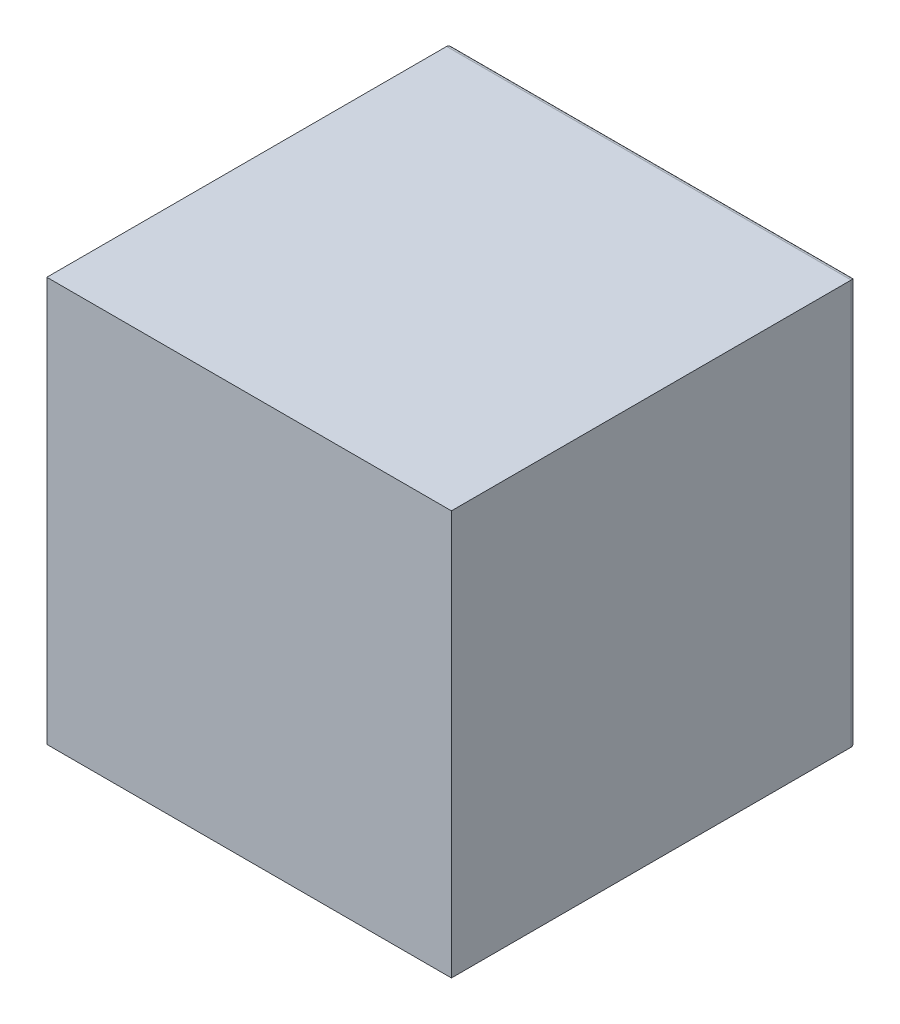
ISO-10303-21;
HEADER;
FILE_DESCRIPTION(('STEP AP214'),'2;1');
FILE_NAME('part.step','',(''),(''),'','','');
FILE_SCHEMA(('AUTOMOTIVE_DESIGN { 1 0 10303 214 1 1 1 1 }'));
ENDSEC;
DATA;
#1=APPLICATION_CONTEXT('core data for automotive mechanical design processes');
#2=APPLICATION_PROTOCOL_DEFINITION('international standard','automotive_design',2000,#1);
#3=PRODUCT_CONTEXT('',#1,'mechanical');
#4=PRODUCT('Part','Part','',(#3));
#5=PRODUCT_RELATED_PRODUCT_CATEGORY('part','',(#4));
#6=PRODUCT_DEFINITION_FORMATION('','',#4);
#7=PRODUCT_DEFINITION_CONTEXT('part definition',#1,'design');
#8=PRODUCT_DEFINITION('design','',#6,#7);
#9=PRODUCT_DEFINITION_SHAPE('','',#8);
#10=(LENGTH_UNIT() NAMED_UNIT(*) SI_UNIT(.MILLI.,.METRE.));
#11=(NAMED_UNIT(*) PLANE_ANGLE_UNIT() SI_UNIT($,.RADIAN.));
#12=(NAMED_UNIT(*) SI_UNIT($,.STERADIAN.) SOLID_ANGLE_UNIT());
#13=UNCERTAINTY_MEASURE_WITH_UNIT(LENGTH_MEASURE(1.E-05),#10,'distance_accuracy_value','');
#14=(GEOMETRIC_REPRESENTATION_CONTEXT(3) GLOBAL_UNCERTAINTY_ASSIGNED_CONTEXT((#13)) GLOBAL_UNIT_ASSIGNED_CONTEXT((#10,
#11,#12)) REPRESENTATION_CONTEXT('',''));
#15=CARTESIAN_POINT('',(0.,0.,0.));
#16=DIRECTION('',(0.,0.,1.));
#17=DIRECTION('',(1.,0.,0.));
#18=AXIS2_PLACEMENT_3D('',#15,#16,#17);
#19=CARTESIAN_POINT('',(0.,2500.,0.));
#20=DIRECTION('',(0.,0.,1.));
#21=DIRECTION('',(1.,0.,0.));
#22=AXIS2_PLACEMENT_3D('',#19,#20,#21);
#23=PLANE('',#22);
#24=DIRECTION('',(-1.,0.,0.));
#25=VECTOR('',#24,1.);
#26=CARTESIAN_POINT('',(0.,29.9999999999998,0.));
#27=LINE('',#26,#25);
#28=CARTESIAN_POINT('',(2470.,29.9999999999998,0.));
#29=VERTEX_POINT('',#28);
#30=CARTESIAN_POINT('',(30.,29.9999999999998,0.));
#31=VERTEX_POINT('',#30);
#32=EDGE_CURVE('E163',#29,#31,#27,.T.);
#33=ORIENTED_EDGE('',*,*,#32,.T.);
#34=DIRECTION('',(0.,-1.,0.));
#35=VECTOR('',#34,1.);
#36=CARTESIAN_POINT('',(30.,2500.,0.));
#37=LINE('',#36,#35);
#38=CARTESIAN_POINT('',(30.,2470.,0.));
#39=VERTEX_POINT('',#38);
#40=EDGE_CURVE('E169',#31,#39,#37,.F.);
#41=ORIENTED_EDGE('',*,*,#40,.T.);
#42=DIRECTION('',(-1.,0.,0.));
#43=VECTOR('',#42,1.);
#44=CARTESIAN_POINT('',(2500.,2470.,0.));
#45=LINE('',#44,#43);
#46=CARTESIAN_POINT('',(2470.,2470.,0.));
#47=VERTEX_POINT('',#46);
#48=EDGE_CURVE('E167',#39,#47,#45,.F.);
#49=ORIENTED_EDGE('',*,*,#48,.T.);
#50=DIRECTION('',(0.,-1.,0.));
#51=VECTOR('',#50,1.);
#52=CARTESIAN_POINT('',(2470.,2500.,0.));
#53=LINE('',#52,#51);
#54=EDGE_CURVE('E165',#47,#29,#53,.T.);
#55=ORIENTED_EDGE('',*,*,#54,.T.);
#56=EDGE_LOOP('',(#33,#41,#49,#55));
#57=FACE_BOUND('',#56,.T.);
#58=DIRECTION('',(0.,1.,0.));
#59=VECTOR('',#58,1.);
#60=CARTESIAN_POINT('',(1974.66392548722,2000.,0.));
#61=LINE('',#60,#59);
#62=CARTESIAN_POINT('',(1974.66392548722,500.,0.));
#63=VERTEX_POINT('',#62);
#64=CARTESIAN_POINT('',(1974.66392548722,2000.,0.));
#65=VERTEX_POINT('',#64);
#66=EDGE_CURVE('E184',#63,#65,#61,.T.);
#67=ORIENTED_EDGE('',*,*,#66,.T.);
#68=DIRECTION('',(-1.,0.,0.));
#69=VECTOR('',#68,1.);
#70=CARTESIAN_POINT('',(474.663925487217,2000.,0.));
#71=LINE('',#70,#69);
#72=CARTESIAN_POINT('',(474.663925487217,2000.,0.));
#73=VERTEX_POINT('',#72);
#74=EDGE_CURVE('E135',#65,#73,#71,.T.);
#75=ORIENTED_EDGE('',*,*,#74,.T.);
#76=DIRECTION('',(0.,-1.,0.));
#77=VECTOR('',#76,1.);
#78=CARTESIAN_POINT('',(474.663925487217,2000.,0.));
#79=LINE('',#78,#77);
#80=CARTESIAN_POINT('',(474.663925487217,500.,0.));
#81=VERTEX_POINT('',#80);
#82=EDGE_CURVE('E192',#73,#81,#79,.T.);
#83=ORIENTED_EDGE('',*,*,#82,.T.);
#84=DIRECTION('',(1.,0.,0.));
#85=VECTOR('',#84,1.);
#86=CARTESIAN_POINT('',(474.663925487217,500.,0.));
#87=LINE('',#86,#85);
#88=EDGE_CURVE('E131',#81,#63,#87,.T.);
#89=ORIENTED_EDGE('',*,*,#88,.T.);
#90=EDGE_LOOP('',(#67,#75,#83,#89));
#91=FACE_BOUND('',#90,.T.);
#92=ADVANCED_FACE('F34',(#57,#91),#23,.F.);
#93=CARTESIAN_POINT('',(0.,2500.,0.));
#94=DIRECTION('',(1.,0.,0.));
#95=DIRECTION('',(0.,0.,-1.));
#96=AXIS2_PLACEMENT_3D('',#93,#94,#95);
#97=PLANE('',#96);
#98=DIRECTION('',(0.,0.,1.));
#99=VECTOR('',#98,1.);
#100=CARTESIAN_POINT('',(0.,2500.,0.));
#101=LINE('',#100,#99);
#102=CARTESIAN_POINT('',(0.,2500.,30.));
#103=VERTEX_POINT('',#102);
#104=CARTESIAN_POINT('',(3.06161699786838E-13,2500.,2500.));
#105=VERTEX_POINT('',#104);
#106=EDGE_CURVE('E145',#103,#105,#101,.T.);
#107=ORIENTED_EDGE('',*,*,#106,.F.);
#108=DIRECTION('',(0.,-1.,0.));
#109=VECTOR('',#108,1.);
#110=CARTESIAN_POINT('',(0.,2500.,30.));
#111=LINE('',#110,#109);
#112=CARTESIAN_POINT('',(0.,0.,30.));
#113=VERTEX_POINT('',#112);
#114=EDGE_CURVE('E160',#103,#113,#111,.T.);
#115=ORIENTED_EDGE('',*,*,#114,.T.);
#116=DIRECTION('',(0.,0.,1.));
#117=VECTOR('',#116,1.);
#118=CARTESIAN_POINT('',(0.,0.,0.));
#119=LINE('',#118,#117);
#120=CARTESIAN_POINT('',(3.06161699786838E-13,0.,2500.));
#121=VERTEX_POINT('',#120);
#122=EDGE_CURVE('E136',#113,#121,#119,.T.);
#123=ORIENTED_EDGE('',*,*,#122,.T.);
#124=DIRECTION('',(0.,-1.,0.));
#125=VECTOR('',#124,1.);
#126=CARTESIAN_POINT('',(3.06161699786838E-13,2500.,2500.));
#127=LINE('',#126,#125);
#128=EDGE_CURVE('E157',#105,#121,#127,.T.);
#129=ORIENTED_EDGE('',*,*,#128,.F.);
#130=EDGE_LOOP('',(#107,#115,#123,#129));
#131=FACE_BOUND('',#130,.T.);
#132=ADVANCED_FACE('F209',(#131),#97,.F.);
#133=CARTESIAN_POINT('',(3.06161699786838E-13,2500.,2500.));
#134=DIRECTION('',(0.,0.,-1.));
#135=DIRECTION('',(-1.,0.,0.));
#136=AXIS2_PLACEMENT_3D('',#133,#134,#135);
#137=PLANE('',#136);
#138=DIRECTION('',(1.,0.,0.));
#139=VECTOR('',#138,1.);
#140=CARTESIAN_POINT('',(3.06161699786838E-13,0.,2500.));
#141=LINE('',#140,#139);
#142=CARTESIAN_POINT('',(2500.,0.,2500.));
#143=VERTEX_POINT('',#142);
#144=EDGE_CURVE('E139',#121,#143,#141,.T.);
#145=ORIENTED_EDGE('',*,*,#144,.T.);
#146=DIRECTION('',(0.,-1.,0.));
#147=VECTOR('',#146,1.);
#148=CARTESIAN_POINT('',(2500.,2500.,2500.));
#149=LINE('',#148,#147);
#150=CARTESIAN_POINT('',(2500.,2500.,2500.));
#151=VERTEX_POINT('',#150);
#152=EDGE_CURVE('E151',#151,#143,#149,.T.);
#153=ORIENTED_EDGE('',*,*,#152,.F.);
#154=DIRECTION('',(1.,0.,0.));
#155=VECTOR('',#154,1.);
#156=CARTESIAN_POINT('',(3.06161699786838E-13,2500.,2500.));
#157=LINE('',#156,#155);
#158=EDGE_CURVE('E147',#105,#151,#157,.T.);
#159=ORIENTED_EDGE('',*,*,#158,.F.);
#160=ORIENTED_EDGE('',*,*,#128,.T.);
#161=EDGE_LOOP('',(#145,#153,#159,#160));
#162=FACE_BOUND('',#161,.T.);
#163=ADVANCED_FACE('F215',(#162),#137,.F.);
#164=CARTESIAN_POINT('',(2500.,2500.,0.));
#165=DIRECTION('',(-1.,0.,0.));
#166=DIRECTION('',(0.,0.,1.));
#167=AXIS2_PLACEMENT_3D('',#164,#165,#166);
#168=PLANE('',#167);
#169=DIRECTION('',(0.,0.,-1.));
#170=VECTOR('',#169,1.);
#171=CARTESIAN_POINT('',(2500.,0.,0.));
#172=LINE('',#171,#170);
#173=CARTESIAN_POINT('',(2500.,0.,30.));
#174=VERTEX_POINT('',#173);
#175=EDGE_CURVE('E148',#143,#174,#172,.T.);
#176=ORIENTED_EDGE('',*,*,#175,.T.);
#177=DIRECTION('',(0.,-1.,0.));
#178=VECTOR('',#177,1.);
#179=CARTESIAN_POINT('',(2500.,2500.,30.));
#180=LINE('',#179,#178);
#181=CARTESIAN_POINT('',(2500.,2500.,30.));
#182=VERTEX_POINT('',#181);
#183=EDGE_CURVE('E43',#174,#182,#180,.F.);
#184=ORIENTED_EDGE('',*,*,#183,.T.);
#185=DIRECTION('',(0.,0.,-1.));
#186=VECTOR('',#185,1.);
#187=CARTESIAN_POINT('',(2500.,2500.,0.));
#188=LINE('',#187,#186);
#189=EDGE_CURVE('E150',#151,#182,#188,.T.);
#190=ORIENTED_EDGE('',*,*,#189,.F.);
#191=ORIENTED_EDGE('',*,*,#152,.T.);
#192=EDGE_LOOP('',(#176,#184,#190,#191));
#193=FACE_BOUND('',#192,.T.);
#194=ADVANCED_FACE('F222',(#193),#168,.F.);
#195=CARTESIAN_POINT('',(0.,2500.,0.));
#196=DIRECTION('',(0.,1.,0.));
#197=DIRECTION('',(0.,0.,1.));
#198=AXIS2_PLACEMENT_3D('',#195,#196,#197);
#199=PLANE('',#198);
#200=ORIENTED_EDGE('',*,*,#189,.T.);
#201=DIRECTION('',(-1.,0.,0.));
#202=VECTOR('',#201,1.);
#203=CARTESIAN_POINT('',(0.,2500.,30.));
#204=LINE('',#203,#202);
#205=EDGE_CURVE('E172',#182,#103,#204,.T.);
#206=ORIENTED_EDGE('',*,*,#205,.T.);
#207=ORIENTED_EDGE('',*,*,#106,.T.);
#208=ORIENTED_EDGE('',*,*,#158,.T.);
#209=EDGE_LOOP('',(#200,#206,#207,#208));
#210=FACE_BOUND('',#209,.T.);
#211=ADVANCED_FACE('F225',(#210),#199,.T.);
#212=CARTESIAN_POINT('',(0.,0.,0.));
#213=DIRECTION('',(0.,1.,0.));
#214=DIRECTION('',(0.,0.,1.));
#215=AXIS2_PLACEMENT_3D('',#212,#213,#214);
#216=PLANE('',#215);
#217=ORIENTED_EDGE('',*,*,#122,.F.);
#218=DIRECTION('',(-1.,0.,0.));
#219=VECTOR('',#218,1.);
#220=CARTESIAN_POINT('',(0.,0.,30.));
#221=LINE('',#220,#219);
#222=EDGE_CURVE('E11',#113,#174,#221,.F.);
#223=ORIENTED_EDGE('',*,*,#222,.T.);
#224=ORIENTED_EDGE('',*,*,#175,.F.);
#225=ORIENTED_EDGE('',*,*,#144,.F.);
#226=EDGE_LOOP('',(#217,#223,#224,#225));
#227=FACE_BOUND('',#226,.T.);
#228=ADVANCED_FACE('F220',(#227),#216,.F.);
#229=CARTESIAN_POINT('',(1974.66392548722,2000.,500.));
#230=DIRECTION('',(-1.,0.,0.));
#231=DIRECTION('',(0.,0.,1.));
#232=AXIS2_PLACEMENT_3D('',#229,#230,#231);
#233=PLANE('',#232);
#234=ORIENTED_EDGE('',*,*,#66,.F.);
#235=DIRECTION('',(0.,0.,-1.));
#236=VECTOR('',#235,1.);
#237=CARTESIAN_POINT('',(1974.66392548722,500.,500.));
#238=LINE('',#237,#236);
#239=CARTESIAN_POINT('',(1974.66392548722,500.,500.));
#240=VERTEX_POINT('',#239);
#241=EDGE_CURVE('E130',#240,#63,#238,.T.);
#242=ORIENTED_EDGE('',*,*,#241,.F.);
#243=DIRECTION('',(0.,1.,0.));
#244=VECTOR('',#243,1.);
#245=CARTESIAN_POINT('',(1974.66392548722,2000.,500.));
#246=LINE('',#245,#244);
#247=CARTESIAN_POINT('',(1974.66392548722,2000.,500.));
#248=VERTEX_POINT('',#247);
#249=EDGE_CURVE('E117',#240,#248,#246,.T.);
#250=ORIENTED_EDGE('',*,*,#249,.T.);
#251=DIRECTION('',(0.,0.,-1.));
#252=VECTOR('',#251,1.);
#253=CARTESIAN_POINT('',(1974.66392548722,2000.,500.));
#254=LINE('',#253,#252);
#255=EDGE_CURVE('E127',#248,#65,#254,.T.);
#256=ORIENTED_EDGE('',*,*,#255,.T.);
#257=EDGE_LOOP('',(#234,#242,#250,#256));
#258=FACE_BOUND('',#257,.T.);
#259=ADVANCED_FACE('F126',(#258),#233,.T.);
#260=CARTESIAN_POINT('',(474.663925487217,2000.,500.));
#261=DIRECTION('',(0.,-1.,0.));
#262=DIRECTION('',(0.,0.,-1.));
#263=AXIS2_PLACEMENT_3D('',#260,#261,#262);
#264=PLANE('',#263);
#265=ORIENTED_EDGE('',*,*,#74,.F.);
#266=ORIENTED_EDGE('',*,*,#255,.F.);
#267=DIRECTION('',(-1.,0.,0.));
#268=VECTOR('',#267,1.);
#269=CARTESIAN_POINT('',(474.663925487217,2000.,500.));
#270=LINE('',#269,#268);
#271=CARTESIAN_POINT('',(474.663925487217,2000.,500.));
#272=VERTEX_POINT('',#271);
#273=EDGE_CURVE('E113',#248,#272,#270,.T.);
#274=ORIENTED_EDGE('',*,*,#273,.T.);
#275=DIRECTION('',(0.,0.,-1.));
#276=VECTOR('',#275,1.);
#277=CARTESIAN_POINT('',(474.663925487217,2000.,500.));
#278=LINE('',#277,#276);
#279=EDGE_CURVE('E137',#272,#73,#278,.T.);
#280=ORIENTED_EDGE('',*,*,#279,.T.);
#281=EDGE_LOOP('',(#265,#266,#274,#280));
#282=FACE_BOUND('',#281,.T.);
#283=ADVANCED_FACE('F133',(#282),#264,.T.);
#284=CARTESIAN_POINT('',(474.663925487217,2000.,500.));
#285=DIRECTION('',(1.,0.,0.));
#286=DIRECTION('',(0.,1.,0.));
#287=AXIS2_PLACEMENT_3D('',#284,#285,#286);
#288=PLANE('',#287);
#289=ORIENTED_EDGE('',*,*,#82,.F.);
#290=ORIENTED_EDGE('',*,*,#279,.F.);
#291=DIRECTION('',(0.,-1.,0.));
#292=VECTOR('',#291,1.);
#293=CARTESIAN_POINT('',(474.663925487217,2000.,500.));
#294=LINE('',#293,#292);
#295=CARTESIAN_POINT('',(474.663925487217,500.,500.));
#296=VERTEX_POINT('',#295);
#297=EDGE_CURVE('E118',#272,#296,#294,.T.);
#298=ORIENTED_EDGE('',*,*,#297,.T.);
#299=DIRECTION('',(0.,0.,-1.));
#300=VECTOR('',#299,1.);
#301=CARTESIAN_POINT('',(474.663925487217,500.,500.));
#302=LINE('',#301,#300);
#303=EDGE_CURVE('E141',#296,#81,#302,.T.);
#304=ORIENTED_EDGE('',*,*,#303,.T.);
#305=EDGE_LOOP('',(#289,#290,#298,#304));
#306=FACE_BOUND('',#305,.T.);
#307=ADVANCED_FACE('F205',(#306),#288,.T.);
#308=CARTESIAN_POINT('',(474.663925487217,500.,500.));
#309=DIRECTION('',(0.,1.,0.));
#310=DIRECTION('',(0.,0.,1.));
#311=AXIS2_PLACEMENT_3D('',#308,#309,#310);
#312=PLANE('',#311);
#313=ORIENTED_EDGE('',*,*,#88,.F.);
#314=ORIENTED_EDGE('',*,*,#303,.F.);
#315=DIRECTION('',(1.,0.,0.));
#316=VECTOR('',#315,1.);
#317=CARTESIAN_POINT('',(474.663925487217,500.,500.));
#318=LINE('',#317,#316);
#319=EDGE_CURVE('E195',#296,#240,#318,.T.);
#320=ORIENTED_EDGE('',*,*,#319,.T.);
#321=ORIENTED_EDGE('',*,*,#241,.T.);
#322=EDGE_LOOP('',(#313,#314,#320,#321));
#323=FACE_BOUND('',#322,.T.);
#324=ADVANCED_FACE('F207',(#323),#312,.T.);
#325=CARTESIAN_POINT('',(0.,0.,500.));
#326=DIRECTION('',(0.,0.,1.));
#327=DIRECTION('',(1.,0.,0.));
#328=AXIS2_PLACEMENT_3D('',#325,#326,#327);
#329=PLANE('',#328);
#330=ORIENTED_EDGE('',*,*,#249,.F.);
#331=ORIENTED_EDGE('',*,*,#319,.F.);
#332=ORIENTED_EDGE('',*,*,#297,.F.);
#333=ORIENTED_EDGE('',*,*,#273,.F.);
#334=EDGE_LOOP('',(#330,#331,#332,#333));
#335=FACE_BOUND('',#334,.T.);
#336=ADVANCED_FACE('F115',(#335),#329,.F.);
#337=CARTESIAN_POINT('',(2470.,2500.,30.));
#338=DIRECTION('',(0.,-1.,0.));
#339=DIRECTION('',(0.,0.,-1.));
#340=AXIS2_PLACEMENT_3D('',#337,#338,#339);
#341=CYLINDRICAL_SURFACE('',#340,30.);
#342=CARTESIAN_POINT('',(2470.,29.9999999999998,30.));
#343=DIRECTION('',(-0.707106781186547,-0.707106781186547,0.));
#344=DIRECTION('',(-0.707106781186547,0.707106781186547,0.));
#345=AXIS2_PLACEMENT_3D('',#342,#343,#344);
#346=ELLIPSE('',#345,42.4264068711928,30.);
#347=EDGE_CURVE('E178',#29,#174,#346,.T.);
#348=ORIENTED_EDGE('',*,*,#347,.F.);
#349=ORIENTED_EDGE('',*,*,#54,.F.);
#350=CARTESIAN_POINT('',(2470.,2470.,30.));
#351=DIRECTION('',(0.707106781186547,-0.707106781186547,0.));
#352=DIRECTION('',(-0.707106781186547,-0.707106781186547,0.));
#353=AXIS2_PLACEMENT_3D('',#350,#351,#352);
#354=ELLIPSE('',#353,42.4264068711928,30.);
#355=EDGE_CURVE('E38',#182,#47,#354,.F.);
#356=ORIENTED_EDGE('',*,*,#355,.F.);
#357=ORIENTED_EDGE('',*,*,#183,.F.);
#358=EDGE_LOOP('',(#348,#349,#356,#357));
#359=FACE_BOUND('',#358,.T.);
#360=ADVANCED_FACE('F36',(#359),#341,.T.);
#361=CARTESIAN_POINT('',(0.,2470.,30.));
#362=DIRECTION('',(1.,0.,0.));
#363=DIRECTION('',(0.,0.,-1.));
#364=AXIS2_PLACEMENT_3D('',#361,#362,#363);
#365=CYLINDRICAL_SURFACE('',#364,30.);
#366=ORIENTED_EDGE('',*,*,#355,.T.);
#367=ORIENTED_EDGE('',*,*,#48,.F.);
#368=CARTESIAN_POINT('',(30.,2470.,30.));
#369=DIRECTION('',(0.707106781186547,0.707106781186547,0.));
#370=DIRECTION('',(0.707106781186547,-0.707106781186547,0.));
#371=AXIS2_PLACEMENT_3D('',#368,#369,#370);
#372=ELLIPSE('',#371,42.4264068711928,30.);
#373=EDGE_CURVE('E177',#103,#39,#372,.F.);
#374=ORIENTED_EDGE('',*,*,#373,.F.);
#375=ORIENTED_EDGE('',*,*,#205,.F.);
#376=EDGE_LOOP('',(#366,#367,#374,#375));
#377=FACE_BOUND('',#376,.T.);
#378=ADVANCED_FACE('F235',(#377),#365,.T.);
#379=CARTESIAN_POINT('',(0.,29.9999999999998,30.));
#380=DIRECTION('',(-1.,0.,0.));
#381=DIRECTION('',(0.,0.,1.));
#382=AXIS2_PLACEMENT_3D('',#379,#380,#381);
#383=CYLINDRICAL_SURFACE('',#382,30.);
#384=ORIENTED_EDGE('',*,*,#347,.T.);
#385=ORIENTED_EDGE('',*,*,#222,.F.);
#386=CARTESIAN_POINT('',(30.,29.9999999999998,30.));
#387=DIRECTION('',(-0.707106781186547,0.707106781186547,0.));
#388=DIRECTION('',(-0.707106781186547,-0.707106781186547,0.));
#389=AXIS2_PLACEMENT_3D('',#386,#387,#388);
#390=ELLIPSE('',#389,42.4264068711928,30.);
#391=EDGE_CURVE('E175',#31,#113,#390,.T.);
#392=ORIENTED_EDGE('',*,*,#391,.F.);
#393=ORIENTED_EDGE('',*,*,#32,.F.);
#394=EDGE_LOOP('',(#384,#385,#392,#393));
#395=FACE_BOUND('',#394,.T.);
#396=ADVANCED_FACE('F232',(#395),#383,.T.);
#397=CARTESIAN_POINT('',(30.,2500.,30.));
#398=DIRECTION('',(0.,-1.,0.));
#399=DIRECTION('',(0.,0.,-1.));
#400=AXIS2_PLACEMENT_3D('',#397,#398,#399);
#401=CYLINDRICAL_SURFACE('',#400,30.);
#402=ORIENTED_EDGE('',*,*,#373,.T.);
#403=ORIENTED_EDGE('',*,*,#40,.F.);
#404=ORIENTED_EDGE('',*,*,#391,.T.);
#405=ORIENTED_EDGE('',*,*,#114,.F.);
#406=EDGE_LOOP('',(#402,#403,#404,#405));
#407=FACE_BOUND('',#406,.T.);
#408=ADVANCED_FACE('F229',(#407),#401,.T.);
#409=CLOSED_SHELL('',(#92,#132,#163,#194,#211,#228,#259,#283,#307,#324,#336,#360,#378,#396,#408));
#410=MANIFOLD_SOLID_BREP('B2',#409);
#411=ADVANCED_BREP_SHAPE_REPRESENTATION('',(#18,#410),#14);
#412=SHAPE_DEFINITION_REPRESENTATION(#9,#411);
ENDSEC;
END-ISO-10303-21;
